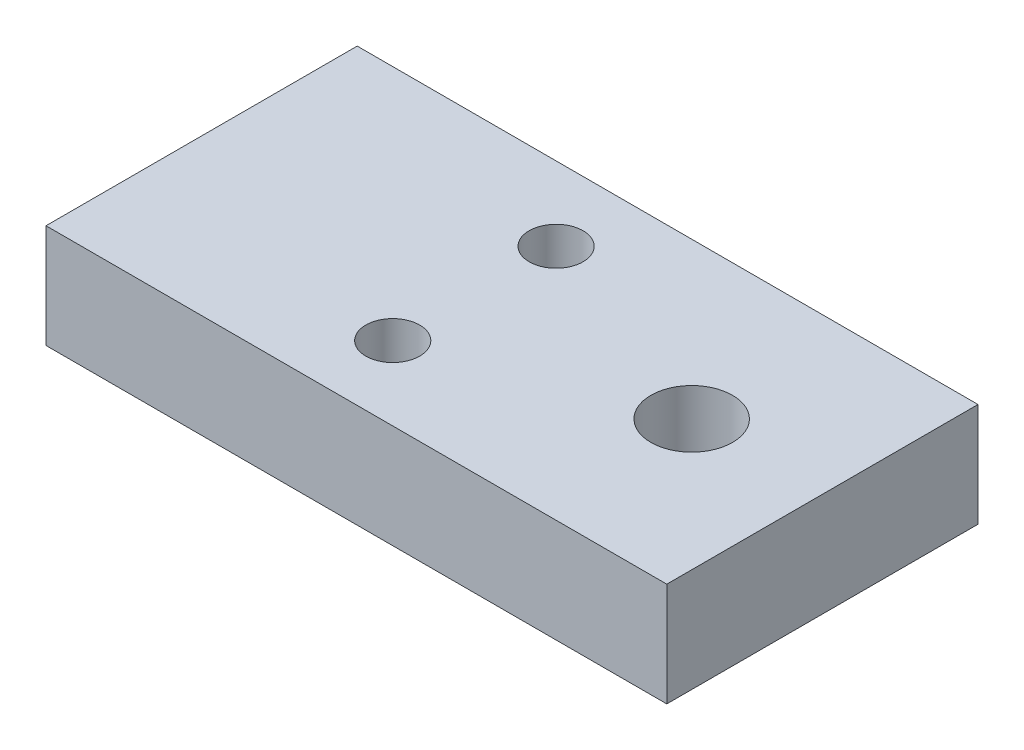
ISO-10303-21;
HEADER;
FILE_DESCRIPTION(('STEP AP214'),'2;1');
FILE_NAME('part.step','',(''),(''),'','','');
FILE_SCHEMA(('AUTOMOTIVE_DESIGN { 1 0 10303 214 1 1 1 1 }'));
ENDSEC;
DATA;
#1=APPLICATION_CONTEXT('core data for automotive mechanical design processes');
#2=APPLICATION_PROTOCOL_DEFINITION('international standard','automotive_design',2000,#1);
#3=PRODUCT_CONTEXT('',#1,'mechanical');
#4=PRODUCT('Part','Part','',(#3));
#5=PRODUCT_RELATED_PRODUCT_CATEGORY('part','',(#4));
#6=PRODUCT_DEFINITION_FORMATION('','',#4);
#7=PRODUCT_DEFINITION_CONTEXT('part definition',#1,'design');
#8=PRODUCT_DEFINITION('design','',#6,#7);
#9=PRODUCT_DEFINITION_SHAPE('','',#8);
#10=(LENGTH_UNIT() NAMED_UNIT(*) SI_UNIT(.MILLI.,.METRE.));
#11=(NAMED_UNIT(*) PLANE_ANGLE_UNIT() SI_UNIT($,.RADIAN.));
#12=(NAMED_UNIT(*) SI_UNIT($,.STERADIAN.) SOLID_ANGLE_UNIT());
#13=UNCERTAINTY_MEASURE_WITH_UNIT(LENGTH_MEASURE(1.E-05),#10,'distance_accuracy_value','');
#14=(GEOMETRIC_REPRESENTATION_CONTEXT(3) GLOBAL_UNCERTAINTY_ASSIGNED_CONTEXT((#13)) GLOBAL_UNIT_ASSIGNED_CONTEXT((#10,
#11,#12)) REPRESENTATION_CONTEXT('',''));
#15=CARTESIAN_POINT('',(0.,0.,0.));
#16=DIRECTION('',(0.,0.,1.));
#17=DIRECTION('',(1.,0.,0.));
#18=AXIS2_PLACEMENT_3D('',#15,#16,#17);
#19=CARTESIAN_POINT('',(-19.,6.35,9.525));
#20=DIRECTION('',(1.,0.,0.));
#21=DIRECTION('',(0.,0.,-1.));
#22=AXIS2_PLACEMENT_3D('',#19,#20,#21);
#23=PLANE('',#22);
#24=DIRECTION('',(0.,0.,1.));
#25=VECTOR('',#24,1.);
#26=CARTESIAN_POINT('',(-19.,0.,9.525));
#27=LINE('',#26,#25);
#28=CARTESIAN_POINT('',(-19.,0.,-9.525));
#29=VERTEX_POINT('',#28);
#30=CARTESIAN_POINT('',(-19.,0.,9.525));
#31=VERTEX_POINT('',#30);
#32=EDGE_CURVE('E98',#29,#31,#27,.T.);
#33=ORIENTED_EDGE('',*,*,#32,.T.);
#34=DIRECTION('',(0.,-1.,0.));
#35=VECTOR('',#34,1.);
#36=CARTESIAN_POINT('',(-19.,6.35,9.525));
#37=LINE('',#36,#35);
#38=CARTESIAN_POINT('',(-19.,6.35,9.525));
#39=VERTEX_POINT('',#38);
#40=EDGE_CURVE('E11',#39,#31,#37,.T.);
#41=ORIENTED_EDGE('',*,*,#40,.F.);
#42=DIRECTION('',(0.,0.,1.));
#43=VECTOR('',#42,1.);
#44=CARTESIAN_POINT('',(-19.,6.35,9.525));
#45=LINE('',#44,#43);
#46=CARTESIAN_POINT('',(-19.,6.35,-9.525));
#47=VERTEX_POINT('',#46);
#48=EDGE_CURVE('E86',#47,#39,#45,.T.);
#49=ORIENTED_EDGE('',*,*,#48,.F.);
#50=DIRECTION('',(0.,-1.,0.));
#51=VECTOR('',#50,1.);
#52=CARTESIAN_POINT('',(-19.,6.35,-9.525));
#53=LINE('',#52,#51);
#54=EDGE_CURVE('E94',#47,#29,#53,.T.);
#55=ORIENTED_EDGE('',*,*,#54,.T.);
#56=EDGE_LOOP('',(#33,#41,#49,#55));
#57=FACE_BOUND('',#56,.T.);
#58=ADVANCED_FACE('F35',(#57),#23,.F.);
#59=CARTESIAN_POINT('',(19.,6.35,9.525));
#60=DIRECTION('',(0.,0.,-1.));
#61=DIRECTION('',(-1.,0.,0.));
#62=AXIS2_PLACEMENT_3D('',#59,#60,#61);
#63=PLANE('',#62);
#64=DIRECTION('',(1.,0.,0.));
#65=VECTOR('',#64,1.);
#66=CARTESIAN_POINT('',(19.,0.,9.525));
#67=LINE('',#66,#65);
#68=CARTESIAN_POINT('',(19.,0.,9.525));
#69=VERTEX_POINT('',#68);
#70=EDGE_CURVE('E90',#31,#69,#67,.T.);
#71=ORIENTED_EDGE('',*,*,#70,.T.);
#72=DIRECTION('',(0.,-1.,0.));
#73=VECTOR('',#72,1.);
#74=CARTESIAN_POINT('',(19.,6.35,9.525));
#75=LINE('',#74,#73);
#76=CARTESIAN_POINT('',(19.,6.35,9.525));
#77=VERTEX_POINT('',#76);
#78=EDGE_CURVE('E43',#77,#69,#75,.T.);
#79=ORIENTED_EDGE('',*,*,#78,.F.);
#80=DIRECTION('',(1.,0.,0.));
#81=VECTOR('',#80,1.);
#82=CARTESIAN_POINT('',(19.,6.35,9.525));
#83=LINE('',#82,#81);
#84=EDGE_CURVE('E81',#39,#77,#83,.T.);
#85=ORIENTED_EDGE('',*,*,#84,.F.);
#86=ORIENTED_EDGE('',*,*,#40,.T.);
#87=EDGE_LOOP('',(#71,#79,#85,#86));
#88=FACE_BOUND('',#87,.T.);
#89=ADVANCED_FACE('F89',(#88),#63,.F.);
#90=CARTESIAN_POINT('',(19.,6.35,9.525));
#91=DIRECTION('',(-1.,0.,0.));
#92=DIRECTION('',(0.,0.,1.));
#93=AXIS2_PLACEMENT_3D('',#90,#91,#92);
#94=PLANE('',#93);
#95=DIRECTION('',(0.,0.,-1.));
#96=VECTOR('',#95,1.);
#97=CARTESIAN_POINT('',(19.,0.,9.525));
#98=LINE('',#97,#96);
#99=CARTESIAN_POINT('',(19.,0.,-9.525));
#100=VERTEX_POINT('',#99);
#101=EDGE_CURVE('E68',#69,#100,#98,.T.);
#102=ORIENTED_EDGE('',*,*,#101,.T.);
#103=DIRECTION('',(0.,-1.,0.));
#104=VECTOR('',#103,1.);
#105=CARTESIAN_POINT('',(19.,6.35,-9.525));
#106=LINE('',#105,#104);
#107=CARTESIAN_POINT('',(19.,6.35,-9.525));
#108=VERTEX_POINT('',#107);
#109=EDGE_CURVE('E91',#108,#100,#106,.T.);
#110=ORIENTED_EDGE('',*,*,#109,.F.);
#111=DIRECTION('',(0.,0.,-1.));
#112=VECTOR('',#111,1.);
#113=CARTESIAN_POINT('',(19.,6.35,9.525));
#114=LINE('',#113,#112);
#115=EDGE_CURVE('E84',#77,#108,#114,.T.);
#116=ORIENTED_EDGE('',*,*,#115,.F.);
#117=ORIENTED_EDGE('',*,*,#78,.T.);
#118=EDGE_LOOP('',(#102,#110,#116,#117));
#119=FACE_BOUND('',#118,.T.);
#120=ADVANCED_FACE('F92',(#119),#94,.F.);
#121=CARTESIAN_POINT('',(19.,6.35,-9.525));
#122=DIRECTION('',(0.,0.,1.));
#123=DIRECTION('',(1.,0.,0.));
#124=AXIS2_PLACEMENT_3D('',#121,#122,#123);
#125=PLANE('',#124);
#126=DIRECTION('',(-1.,0.,0.));
#127=VECTOR('',#126,1.);
#128=CARTESIAN_POINT('',(19.,0.,-9.525));
#129=LINE('',#128,#127);
#130=EDGE_CURVE('E74',#100,#29,#129,.T.);
#131=ORIENTED_EDGE('',*,*,#130,.T.);
#132=ORIENTED_EDGE('',*,*,#54,.F.);
#133=DIRECTION('',(-1.,0.,0.));
#134=VECTOR('',#133,1.);
#135=CARTESIAN_POINT('',(19.,6.35,-9.525));
#136=LINE('',#135,#134);
#137=EDGE_CURVE('E51',#108,#47,#136,.T.);
#138=ORIENTED_EDGE('',*,*,#137,.F.);
#139=ORIENTED_EDGE('',*,*,#109,.T.);
#140=EDGE_LOOP('',(#131,#132,#138,#139));
#141=FACE_BOUND('',#140,.T.);
#142=ADVANCED_FACE('F106',(#141),#125,.F.);
#143=CARTESIAN_POINT('',(0.,6.35,0.));
#144=DIRECTION('',(0.,1.,0.));
#145=DIRECTION('',(0.,0.,1.));
#146=AXIS2_PLACEMENT_3D('',#143,#144,#145);
#147=PLANE('',#146);
#148=CARTESIAN_POINT('',(11.,6.35,0.));
#149=DIRECTION('',(0.,1.,0.));
#150=DIRECTION('',(0.,0.,1.));
#151=AXIS2_PLACEMENT_3D('',#148,#149,#150);
#152=CIRCLE('',#151,2.5);
#153=CARTESIAN_POINT('',(11.,6.35,2.5));
#154=VERTEX_POINT('',#153);
#155=EDGE_CURVE('E126',#154,#154,#152,.T.);
#156=ORIENTED_EDGE('',*,*,#155,.F.);
#157=EDGE_LOOP('',(#156));
#158=FACE_BOUND('',#157,.T.);
#159=CARTESIAN_POINT('',(-2.3,6.35,-5.));
#160=DIRECTION('',(0.,1.,0.));
#161=DIRECTION('',(0.,0.,1.));
#162=AXIS2_PLACEMENT_3D('',#159,#160,#161);
#163=CIRCLE('',#162,1.65);
#164=CARTESIAN_POINT('',(-2.3,6.35,-3.35));
#165=VERTEX_POINT('',#164);
#166=EDGE_CURVE('E120',#165,#165,#163,.T.);
#167=ORIENTED_EDGE('',*,*,#166,.F.);
#168=EDGE_LOOP('',(#167));
#169=FACE_BOUND('',#168,.T.);
#170=CARTESIAN_POINT('',(-2.3,6.35,5.));
#171=DIRECTION('',(0.,1.,0.));
#172=DIRECTION('',(0.,0.,1.));
#173=AXIS2_PLACEMENT_3D('',#170,#171,#172);
#174=CIRCLE('',#173,1.65);
#175=CARTESIAN_POINT('',(-2.3,6.35,6.65));
#176=VERTEX_POINT('',#175);
#177=EDGE_CURVE('E114',#176,#176,#174,.T.);
#178=ORIENTED_EDGE('',*,*,#177,.F.);
#179=EDGE_LOOP('',(#178));
#180=FACE_BOUND('',#179,.T.);
#181=ORIENTED_EDGE('',*,*,#48,.T.);
#182=ORIENTED_EDGE('',*,*,#84,.T.);
#183=ORIENTED_EDGE('',*,*,#115,.T.);
#184=ORIENTED_EDGE('',*,*,#137,.T.);
#185=EDGE_LOOP('',(#181,#182,#183,#184));
#186=FACE_BOUND('',#185,.T.);
#187=ADVANCED_FACE('F82',(#158,#169,#180,#186),#147,.T.);
#188=CARTESIAN_POINT('',(0.,0.,0.));
#189=DIRECTION('',(0.,1.,0.));
#190=DIRECTION('',(0.,0.,1.));
#191=AXIS2_PLACEMENT_3D('',#188,#189,#190);
#192=PLANE('',#191);
#193=CARTESIAN_POINT('',(11.,0.,0.));
#194=DIRECTION('',(0.,1.,0.));
#195=DIRECTION('',(0.,0.,1.));
#196=AXIS2_PLACEMENT_3D('',#193,#194,#195);
#197=CIRCLE('',#196,2.5);
#198=CARTESIAN_POINT('',(11.,0.,2.5));
#199=VERTEX_POINT('',#198);
#200=EDGE_CURVE('E123',#199,#199,#197,.T.);
#201=ORIENTED_EDGE('',*,*,#200,.T.);
#202=EDGE_LOOP('',(#201));
#203=FACE_BOUND('',#202,.T.);
#204=CARTESIAN_POINT('',(-2.3,0.,-5.));
#205=DIRECTION('',(0.,1.,0.));
#206=DIRECTION('',(0.,0.,1.));
#207=AXIS2_PLACEMENT_3D('',#204,#205,#206);
#208=CIRCLE('',#207,1.65);
#209=CARTESIAN_POINT('',(-2.3,0.,-3.35));
#210=VERTEX_POINT('',#209);
#211=EDGE_CURVE('E117',#210,#210,#208,.T.);
#212=ORIENTED_EDGE('',*,*,#211,.T.);
#213=EDGE_LOOP('',(#212));
#214=FACE_BOUND('',#213,.T.);
#215=CARTESIAN_POINT('',(-2.3,0.,5.));
#216=DIRECTION('',(0.,1.,0.));
#217=DIRECTION('',(0.,0.,1.));
#218=AXIS2_PLACEMENT_3D('',#215,#216,#217);
#219=CIRCLE('',#218,1.65);
#220=CARTESIAN_POINT('',(-2.3,0.,6.65));
#221=VERTEX_POINT('',#220);
#222=EDGE_CURVE('E101',#221,#221,#219,.T.);
#223=ORIENTED_EDGE('',*,*,#222,.T.);
#224=EDGE_LOOP('',(#223));
#225=FACE_BOUND('',#224,.T.);
#226=ORIENTED_EDGE('',*,*,#32,.F.);
#227=ORIENTED_EDGE('',*,*,#130,.F.);
#228=ORIENTED_EDGE('',*,*,#101,.F.);
#229=ORIENTED_EDGE('',*,*,#70,.F.);
#230=EDGE_LOOP('',(#226,#227,#228,#229));
#231=FACE_BOUND('',#230,.T.);
#232=ADVANCED_FACE('F109',(#203,#214,#225,#231),#192,.F.);
#233=CARTESIAN_POINT('',(-2.3,6.35,5.));
#234=DIRECTION('',(0.,1.,0.));
#235=DIRECTION('',(0.,0.,1.));
#236=AXIS2_PLACEMENT_3D('',#233,#234,#235);
#237=CYLINDRICAL_SURFACE('',#236,1.65);
#238=ORIENTED_EDGE('',*,*,#222,.F.);
#239=EDGE_LOOP('',(#238));
#240=FACE_BOUND('',#239,.T.);
#241=ORIENTED_EDGE('',*,*,#177,.T.);
#242=EDGE_LOOP('',(#241));
#243=FACE_BOUND('',#242,.T.);
#244=ADVANCED_FACE('F139',(#240,#243),#237,.F.);
#245=CARTESIAN_POINT('',(-2.3,6.35,-5.));
#246=DIRECTION('',(0.,1.,0.));
#247=DIRECTION('',(0.,0.,1.));
#248=AXIS2_PLACEMENT_3D('',#245,#246,#247);
#249=CYLINDRICAL_SURFACE('',#248,1.65);
#250=ORIENTED_EDGE('',*,*,#211,.F.);
#251=EDGE_LOOP('',(#250));
#252=FACE_BOUND('',#251,.T.);
#253=ORIENTED_EDGE('',*,*,#166,.T.);
#254=EDGE_LOOP('',(#253));
#255=FACE_BOUND('',#254,.T.);
#256=ADVANCED_FACE('F141',(#252,#255),#249,.F.);
#257=CARTESIAN_POINT('',(11.,6.35,0.));
#258=DIRECTION('',(0.,1.,0.));
#259=DIRECTION('',(0.,0.,1.));
#260=AXIS2_PLACEMENT_3D('',#257,#258,#259);
#261=CYLINDRICAL_SURFACE('',#260,2.5);
#262=ORIENTED_EDGE('',*,*,#200,.F.);
#263=EDGE_LOOP('',(#262));
#264=FACE_BOUND('',#263,.T.);
#265=ORIENTED_EDGE('',*,*,#155,.T.);
#266=EDGE_LOOP('',(#265));
#267=FACE_BOUND('',#266,.T.);
#268=ADVANCED_FACE('F130',(#264,#267),#261,.F.);
#269=CLOSED_SHELL('',(#58,#89,#120,#142,#187,#232,#244,#256,#268));
#270=MANIFOLD_SOLID_BREP('B2',#269);
#271=ADVANCED_BREP_SHAPE_REPRESENTATION('',(#18,#270),#14);
#272=SHAPE_DEFINITION_REPRESENTATION(#9,#271);
ENDSEC;
END-ISO-10303-21;
